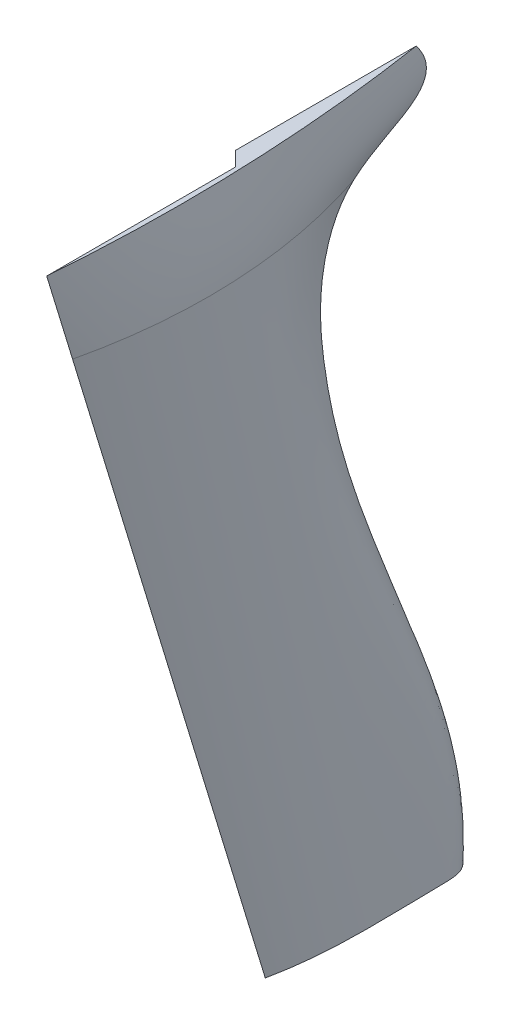
ISO-10303-21;
HEADER;
FILE_DESCRIPTION(('STEP AP214'),'2;1');
FILE_NAME('part.step','',(''),(''),'','','');
FILE_SCHEMA(('AUTOMOTIVE_DESIGN { 1 0 10303 214 1 1 1 1 }'));
ENDSEC;
DATA;
#1=APPLICATION_CONTEXT('core data for automotive mechanical design processes');
#2=APPLICATION_PROTOCOL_DEFINITION('international standard','automotive_design',2000,#1);
#3=PRODUCT_CONTEXT('',#1,'mechanical');
#4=PRODUCT('Part','Part','',(#3));
#5=PRODUCT_RELATED_PRODUCT_CATEGORY('part','',(#4));
#6=PRODUCT_DEFINITION_FORMATION('','',#4);
#7=PRODUCT_DEFINITION_CONTEXT('part definition',#1,'design');
#8=PRODUCT_DEFINITION('design','',#6,#7);
#9=PRODUCT_DEFINITION_SHAPE('','',#8);
#10=(LENGTH_UNIT() NAMED_UNIT(*) SI_UNIT(.MILLI.,.METRE.));
#11=(NAMED_UNIT(*) PLANE_ANGLE_UNIT() SI_UNIT($,.RADIAN.));
#12=(NAMED_UNIT(*) SI_UNIT($,.STERADIAN.) SOLID_ANGLE_UNIT());
#13=UNCERTAINTY_MEASURE_WITH_UNIT(LENGTH_MEASURE(1.E-05),#10,'distance_accuracy_value','');
#14=(GEOMETRIC_REPRESENTATION_CONTEXT(3) GLOBAL_UNCERTAINTY_ASSIGNED_CONTEXT((#13)) GLOBAL_UNIT_ASSIGNED_CONTEXT((#10,
#11,#12)) REPRESENTATION_CONTEXT('',''));
#15=CARTESIAN_POINT('',(0.,0.,0.));
#16=DIRECTION('',(0.,0.,1.));
#17=DIRECTION('',(1.,0.,0.));
#18=AXIS2_PLACEMENT_3D('',#15,#16,#17);
#19=CARTESIAN_POINT('',(1.17347259491747,0.,-15.0754418502589));
#20=DIRECTION('',(0.,-1.,0.));
#21=DIRECTION('',(1.,0.,0.));
#22=AXIS2_PLACEMENT_3D('',#19,#20,#21);
#23=PLANE('',#22);
#24=DIRECTION('',(0.,0.,1.));
#25=VECTOR('',#24,1.);
#26=CARTESIAN_POINT('',(0.,0.,-26.5534962443813));
#27=LINE('',#26,#25);
#28=CARTESIAN_POINT('',(0.,0.,-26.5534962443813));
#29=VERTEX_POINT('',#28);
#30=CARTESIAN_POINT('',(0.,0.,0.));
#31=VERTEX_POINT('',#30);
#32=EDGE_CURVE('E376',#29,#31,#27,.T.);
#33=ORIENTED_EDGE('',*,*,#32,.F.);
#34=DIRECTION('',(0.707106781186548,0.,0.707106781186547));
#35=VECTOR('',#34,1.);
#36=CARTESIAN_POINT('',(-2.032,0.,-28.5854962443813));
#37=LINE('',#36,#35);
#38=CARTESIAN_POINT('',(-2.032,0.,-28.5854962443813));
#39=VERTEX_POINT('',#38);
#40=EDGE_CURVE('E13',#39,#29,#37,.T.);
#41=ORIENTED_EDGE('',*,*,#40,.F.);
#42=CARTESIAN_POINT('',(0.,0.,0.));
#43=CARTESIAN_POINT('',(0.868955437855163,0.,-4.15213360251585));
#44=CARTESIAN_POINT('',(1.28304064187775,0.,-10.4499327545263));
#45=CARTESIAN_POINT('',(1.11302386498906,0.,-18.5577165385589));
#46=CARTESIAN_POINT('',(1.07985622164203,0.,-23.3867610957331));
#47=CARTESIAN_POINT('',(0.927305881123967,0.,-27.3895650347186));
#48=CARTESIAN_POINT('',(-1.06664213218579,0.,-28.7222309558563));
#49=CARTESIAN_POINT('',(-2.032,0.,-28.5854962443813));
#50=B_SPLINE_CURVE_WITH_KNOTS('',3,(#42,#43,#44,#45,#46,#47,#48,#49),.UNSPECIFIED.,.F.,.F.,(4,1,
1,1,1,4),(0.,0.41768328443092,0.626781802257852,0.798428839966411,0.906706218110106,1.),.UNSPECIFIED.);
#51=EDGE_CURVE('E201',#31,#39,#50,.T.);
#52=ORIENTED_EDGE('',*,*,#51,.F.);
#53=EDGE_LOOP('',(#33,#41,#52));
#54=FACE_BOUND('',#53,.T.);
#55=ADVANCED_FACE('F191',(#54),#23,.T.);
#56=CARTESIAN_POINT('',(-2.032,88.9,-1.49084743129355));
#57=DIRECTION('',(-1.,0.,0.));
#58=DIRECTION('',(0.,0.,-1.));
#59=AXIS2_PLACEMENT_3D('',#56,#57,#58);
#60=PLANE('',#59);
#61=DIRECTION('',(0.,0.956559534241169,0.291537060169574));
#62=VECTOR('',#61,1.);
#63=CARTESIAN_POINT('',(-2.032,44.45,-15.0381718378374));
#64=LINE('',#63,#62);
#65=CARTESIAN_POINT('',(-2.032,100.838,2.14757683789251));
#66=VERTEX_POINT('',#65);
#67=EDGE_CURVE('E331',#39,#66,#64,.T.);
#68=ORIENTED_EDGE('',*,*,#67,.T.);
#69=DIRECTION('',(0.,0.,-1.));
#70=VECTOR('',#69,1.);
#71=CARTESIAN_POINT('',(-2.032,100.838,2.14757683789251));
#72=LINE('',#71,#70);
#73=CARTESIAN_POINT('',(-2.03199999999998,100.838,-23.2524231621075));
#74=VERTEX_POINT('',#73);
#75=EDGE_CURVE('E258',#66,#74,#72,.T.);
#76=ORIENTED_EDGE('',*,*,#75,.T.);
#77=CARTESIAN_POINT('',(-2.03199999999999,88.9,-14.4490304308033));
#78=CARTESIAN_POINT('',(-2.032,90.1594035536287,-15.8258956353721));
#79=CARTESIAN_POINT('',(-2.032,92.9684732394471,-20.8132117463626));
#80=CARTESIAN_POINT('',(-2.032,96.0838747700888,-26.8664565291203));
#81=CARTESIAN_POINT('',(-2.03199999999998,100.838,-23.2524231621075));
#82=B_SPLINE_CURVE_WITH_KNOTS('',3,(#77,#78,#79,#80,#81),.UNSPECIFIED.,.F.,.F.,(4,1,4),(0.,
0.339308522008112,1.),.UNSPECIFIED.);
#83=CARTESIAN_POINT('',(-2.032,88.9,-14.4490304308033));
#84=VERTEX_POINT('',#83);
#85=EDGE_CURVE('E246',#84,#74,#82,.T.);
#86=ORIENTED_EDGE('',*,*,#85,.F.);
#87=CARTESIAN_POINT('',(-2.032,88.9,-14.4490304308033));
#88=CARTESIAN_POINT('',(-2.032,88.6360872823388,-14.1605031855499));
#89=CARTESIAN_POINT('',(-2.032,86.4749006328394,-12.0202240949158));
#90=CARTESIAN_POINT('',(-2.032,79.0529493440888,-9.22853105217397));
#91=CARTESIAN_POINT('',(-2.032,69.603367670543,-9.99601596826649));
#92=CARTESIAN_POINT('',(-2.032,52.7250369566644,-13.230740713342));
#93=CARTESIAN_POINT('',(-2.032,31.1220140510674,-22.6642550417858));
#94=CARTESIAN_POINT('',(-2.032,10.7417806882659,-29.6939795521676));
#95=CARTESIAN_POINT('',(-2.032,0.,-28.5854962443813));
#96=B_SPLINE_CURVE_WITH_KNOTS('',3,(#87,#88,#89,#90,#91,#92,#93,#94,#95),.UNSPECIFIED.,.F.,.F.,
(4,1,1,1,1,1,4),(0.,0.0130534385610087,0.101711711688787,0.238248525325182,0.317694364182804,
0.656493029064736,1.),.UNSPECIFIED.);
#97=EDGE_CURVE('E412',#84,#39,#96,.T.);
#98=ORIENTED_EDGE('',*,*,#97,.T.);
#99=EDGE_LOOP('',(#68,#76,#86,#98));
#100=FACE_BOUND('',#99,.T.);
#101=ADVANCED_FACE('F290',(#100),#60,.T.);
#102=CARTESIAN_POINT('',(-2.03199999999999,88.9,-14.4490304308033));
#103=CARTESIAN_POINT('',(-2.032,88.6360872823388,-14.1605031855499));
#104=CARTESIAN_POINT('',(-2.032,86.4749006328394,-12.0202240949158));
#105=CARTESIAN_POINT('',(-2.032,79.0529493440888,-9.22853105217397));
#106=CARTESIAN_POINT('',(-2.032,69.603367670543,-9.99601596826649));
#107=CARTESIAN_POINT('',(-2.032,52.7250369566644,-13.230740713342));
#108=CARTESIAN_POINT('',(-2.032,31.1220140510674,-22.6642550417858));
#109=CARTESIAN_POINT('',(-2.032,10.7417806882659,-29.6939795521676));
#110=CARTESIAN_POINT('',(-2.032,0.,-28.5854962443813));
#111=CARTESIAN_POINT('',(-1.9559496224145,88.9,-14.2235522282885));
#112=CARTESIAN_POINT('',(-1.95554155001475,88.6360872823388,-13.9361107416901));
#113=CARTESIAN_POINT('',(-1.95236187118313,86.4749006328394,-11.8042918258034));
#114=CARTESIAN_POINT('',(-1.94491382237869,79.0529493440888,-9.03241581419893));
#115=CARTESIAN_POINT('',(-1.93539023570062,69.603367670543,-9.82524014719032));
#116=CARTESIAN_POINT('',(-1.9180468405129,52.7250369566644,-13.1061104817331));
#117=CARTESIAN_POINT('',(-1.89423321080635,31.1220140510674,-22.6029857593033));
#118=CARTESIAN_POINT('',(-1.87290319137319,10.7417806882659,-29.6894630743949));
#119=CARTESIAN_POINT('',(-1.86216458688153,0.,-28.6095519826575));
#120=CARTESIAN_POINT('',(-1.80713196031202,88.9,-13.7755496574275));
#121=CARTESIAN_POINT('',(-1.80585583058491,88.6358472351154,-13.4907536622877));
#122=CARTESIAN_POINT('',(-1.79591259664375,86.4729948231026,-11.3793374867938));
#123=CARTESIAN_POINT('',(-1.77262376084683,79.0517502791207,-8.6509132552977));
#124=CARTESIAN_POINT('',(-1.74284934680535,69.602992932875,-9.49082670371665));
#125=CARTESIAN_POINT('',(-1.68863957857439,52.7255182951859,-12.8538621893159));
#126=CARTESIAN_POINT('',(-1.61423208278575,31.1206004433767,-22.4538046640227));
#127=CARTESIAN_POINT('',(-1.54761047706621,10.7406820083514,-29.6353732710566));
#128=CARTESIAN_POINT('',(-1.51407897800083,0.,-28.612413633352));
#129=CARTESIAN_POINT('',(-1.52203464518594,88.9,-12.8903344935873));
#130=CARTESIAN_POINT('',(-1.51902470577521,88.6344669635811,-12.61255084737));
#131=CARTESIAN_POINT('',(-1.49557341752237,86.462036417116,-10.5545624843619));
#132=CARTESIAN_POINT('',(-1.44065525221865,79.0448556555546,-7.92633551108036));
#133=CARTESIAN_POINT('',(-1.37046154066225,69.6008381912841,-8.84565803929346));
#134=CARTESIAN_POINT('',(-1.24271392280234,52.728285991684,-12.332669856822));
#135=CARTESIAN_POINT('',(-1.06748092983496,31.1124721991552,-22.0467719426185));
#136=CARTESIAN_POINT('',(-0.910693628926494,10.7343645988431,-29.3465407881865));
#137=CARTESIAN_POINT('',(-0.831819752824955,0.,-28.4352859121491));
#138=CARTESIAN_POINT('',(-1.18805733731017,88.9,-11.802124199579));
#139=CARTESIAN_POINT('',(-1.18319502238179,88.6311663142598,-11.536325825999));
#140=CARTESIAN_POINT('',(-1.14531408797997,86.435831533235,-9.56882772451127));
#141=CARTESIAN_POINT('',(-1.05662360631168,79.0283685122443,-7.09289761881771));
#142=CARTESIAN_POINT('',(-0.943302607426443,69.5956855483493,-8.09047702220413));
#143=CARTESIAN_POINT('',(-0.737178551375169,52.7349043963534,-11.6706569280489));
#144=CARTESIAN_POINT('',(-0.454672143473132,31.0930350934082,-21.3786093856023));
#145=CARTESIAN_POINT('',(-0.202136164140801,10.7192577500189,-28.7110034886836));
#146=CARTESIAN_POINT('',(-0.075177914403229,0.,-27.9409921624878));
#147=CARTESIAN_POINT('',(-0.819549326338881,88.9,-10.5194135512791));
#148=CARTESIAN_POINT('',(-0.813379296914512,88.625045110064,-10.2727894943692));
#149=CARTESIAN_POINT('',(-0.765315746988696,86.3872333849466,-8.44932156383716));
#150=CARTESIAN_POINT('',(-0.652822402458278,78.9977923555598,-6.20011203913702));
#151=CARTESIAN_POINT('',(-0.509165187588784,69.5861297378158,-7.27157420638974));
#152=CARTESIAN_POINT('',(-0.248083956450739,52.7471785286495,-10.8947894529509));
#153=CARTESIAN_POINT('',(0.109275358536762,31.0569880972954,-20.4131840583148));
#154=CARTESIAN_POINT('',(0.428260943571023,10.6912414121995,-27.646510289185));
#155=CARTESIAN_POINT('',(0.588460117036684,0.,-27.0581041196332));
#156=CARTESIAN_POINT('',(-0.479739894675935,88.9,-9.25369245473262));
#157=CARTESIAN_POINT('',(-0.473581179561342,88.6171235516929,-9.03047786958289));
#158=CARTESIAN_POINT('',(-0.425614404559167,86.3243416636322,-7.38245935052497));
#159=CARTESIAN_POINT('',(-0.313407560122343,78.958223211615,-5.40102145230849));
#160=CARTESIAN_POINT('',(-0.170238969265299,69.5737633947723,-6.5353229909613));
#161=CARTESIAN_POINT('',(0.0895992979041165,52.7630626998561,-10.154548280888));
#162=CARTESIAN_POINT('',(0.444507959411454,31.0103390435025,-19.3456858650201));
#163=CARTESIAN_POINT('',(0.760567139417229,10.6549849750214,-26.377406228522));
#164=CARTESIAN_POINT('',(0.919031733249027,0.,-25.9870644601396));
#165=CARTESIAN_POINT('',(-0.165062863150032,88.9,-7.99880875718269));
#166=CARTESIAN_POINT('',(-0.159782824326302,88.6077617099816,-7.80284619550879));
#167=CARTESIAN_POINT('',(-0.118672170295813,86.250015083897,-6.3589533915263));
#168=CARTESIAN_POINT('',(-0.0225911488315554,78.9114596778622,-4.68642238017228));
#169=CARTESIAN_POINT('',(0.0998226999140654,69.559148625721,-5.88533481285454));
#170=CARTESIAN_POINT('',(0.321474221850749,52.7818349021913,-9.48226586400675));
#171=CARTESIAN_POINT('',(0.623127658704488,30.9552083435653,-18.2625103168255));
#172=CARTESIAN_POINT('',(0.890677473417118,10.6121364583564,-25.0343513906021));
#173=CARTESIAN_POINT('',(1.02443122980886,0.,-24.867201427604));
#174=CARTESIAN_POINT('',(0.125620521389397,88.8999999999999,-6.75107978978765));
#175=CARTESIAN_POINT('',(0.129774859192403,88.5973196557652,-6.58533613357386));
#176=CARTESIAN_POINT('',(0.16210436175935,86.1671123603461,-5.36773838352001));
#177=CARTESIAN_POINT('',(0.237548813437833,78.8593003517532,-4.03651691207258));
#178=CARTESIAN_POINT('',(0.333436951397353,69.5428475371637,-5.30335288214067));
#179=CARTESIAN_POINT('',(0.506382929278929,52.8027731278727,-8.86787573074052));
#180=CARTESIAN_POINT('',(0.740318555897991,30.8937164090201,-17.1794639952424));
#181=CARTESIAN_POINT('',(0.946385529754647,10.5643438820762,-23.6521669623565));
#182=CARTESIAN_POINT('',(1.04889007283805,0.,-23.7292922652205));
#183=CARTESIAN_POINT('',(0.393449012092918,88.8999999999999,-5.50682288370583));
#184=CARTESIAN_POINT('',(0.396581313555321,88.5861574598786,-5.37330062284197));
#185=CARTESIAN_POINT('',(0.420937867823591,86.0784922075849,-4.39696898080149));
#186=CARTESIAN_POINT('',(0.477642025139658,78.8035438307402,-3.42910775367047));
#187=CARTESIAN_POINT('',(0.549435596360883,69.5254222356024,-4.7666504242177));
#188=CARTESIAN_POINT('',(0.678121970293454,52.8251553691185,-8.29307065523705));
#189=CARTESIAN_POINT('',(0.850483513689812,30.8279836514027,-16.0989352111977));
#190=CARTESIAN_POINT('',(1.00060911354405,10.5132552660525,-22.2476183258871));
#191=CARTESIAN_POINT('',(1.07466804797296,0.,-22.5837236433882));
#192=CARTESIAN_POINT('',(0.6395613621111,88.9,-4.26235537009558));
#193=CARTESIAN_POINT('',(0.641720028789185,88.5746351931571,-4.16205705186043));
#194=CARTESIAN_POINT('',(0.658481910633463,85.9870133402186,-3.43448727938086));
#195=CARTESIAN_POINT('',(0.6973397137753,78.7459887122751,-2.84103619203551));
#196=CARTESIAN_POINT('',(0.746197861745455,69.5074348275393,-4.25070956854566));
#197=CARTESIAN_POINT('',(0.832782011531339,52.8482596181464,-7.73624139103194));
#198=CARTESIAN_POINT('',(0.946629589314553,30.7601304822493,-15.0179356554071));
#199=CARTESIAN_POINT('',(1.043651010786,10.4605186301571,-20.8302360110418));
#200=CARTESIAN_POINT('',(1.09072710244833,0.,-21.4327118527897));
#201=CARTESIAN_POINT('',(0.865096324594509,88.9,-3.01399458011524));
#202=CARTESIAN_POINT('',(0.866357730870507,88.5631129264355,-2.94693837316528));
#203=CARTESIAN_POINT('',(0.876121859049864,85.8955344728521,-2.46827221304441));
#204=CARTESIAN_POINT('',(0.898544117446494,78.6884335938101,-2.24956442255488));
#205=CARTESIAN_POINT('',(0.926296544262942,69.4894474194761,-3.73179658500437));
#206=CARTESIAN_POINT('',(0.974184882170294,52.8713638671742,-7.17722431373725));
#207=CARTESIAN_POINT('',(1.03435235160497,30.6922773130959,-13.9358308987668));
#208=CARTESIAN_POINT('',(1.08275327749228,10.4077819942617,-19.4127179604036));
#209=CARTESIAN_POINT('',(1.10515884409931,0.,-20.2820501700442));
#210=CARTESIAN_POINT('',(1.07033923086197,88.9,-1.75789637607556));
#211=CARTESIAN_POINT('',(1.0707767666052,88.551950730549,-1.7231090304763));
#212=CARTESIAN_POINT('',(1.07411748479512,85.806914320091,-1.48607935169366));
#213=CARTESIAN_POINT('',(1.08146685049167,78.6326770727971,-1.63160278475155));
#214=CARTESIAN_POINT('',(1.0898913350177,69.4720221179149,-3.18566158894061));
#215=CARTESIAN_POINT('',(1.10242359473972,52.89374610842,-6.59504044027302));
#216=CARTESIAN_POINT('',(1.11371199438789,30.6265445554786,-12.8507603263635));
#217=CARTESIAN_POINT('',(1.11800444886947,10.356693378238,-18.006167950287));
#218=CARTESIAN_POINT('',(1.11808670398226,0.,-19.135752445633));
#219=CARTESIAN_POINT('',(1.25557541223233,88.9,-0.490216620287321));
#220=CARTESIAN_POINT('',(1.25528037985,88.5415086763326,-0.485736737351581));
#221=CARTESIAN_POINT('',(1.25291228537125,85.7240115965402,-0.475693013477959));
#222=CARTESIAN_POINT('',(1.24688466146152,78.5805177466881,-0.964150046775172));
#223=CARTESIAN_POINT('',(1.23819475434052,69.4557210293576,-2.58821943575869));
#224=CARTESIAN_POINT('',(1.21953213194995,52.9146843341015,-5.96901449829529));
#225=CARTESIAN_POINT('',(1.18792915799551,30.5650526209333,-11.7613578499615));
#226=CARTESIAN_POINT('',(1.15374579932155,10.3089008019578,-16.6223551987347));
#227=CARTESIAN_POINT('',(1.13443676742458,0.,-17.9985840189977));
#228=CARTESIAN_POINT('',(1.42109020002439,88.9,0.792888824938712));
#229=CARTESIAN_POINT('',(1.42013869091827,88.5321468346214,0.770014700883094));
#230=CARTESIAN_POINT('',(1.41265853781645,85.649685016805,0.575136844427835));
#231=CARTESIAN_POINT('',(1.394678514724,78.5337542129353,-0.224099283593483));
#232=CARTESIAN_POINT('',(1.37075050169147,69.4411062603063,-1.91518807742199));
#233=CARTESIAN_POINT('',(1.32446787921896,52.9334565364366,-5.27810820909811));
#234=CARTESIAN_POINT('',(1.25521491524757,30.5099219209962,-10.6656663046562));
#235=CARTESIAN_POINT('',(1.18757766203229,10.2660522852928,-15.2722535630983));
#236=CARTESIAN_POINT('',(1.15152251793649,0.,-16.8744120220383));
#237=CARTESIAN_POINT('',(1.56716892555701,88.9,2.09526409729177));
#238=CARTESIAN_POINT('',(1.56562231399791,88.5242252762503,2.04898248134313));
#239=CARTESIAN_POINT('',(1.55351286128818,85.5867932954906,1.67866907825939));
#240=CARTESIAN_POINT('',(1.52474273085724,78.4941850689905,0.611683539574993));
#241=CARTESIAN_POINT('',(1.48712715877653,69.4287399172628,-1.1422349611896));
#242=CARTESIAN_POINT('',(1.41623409426398,52.9493407076433,-4.50119018473934));
#243=CARTESIAN_POINT('',(1.31385503199575,30.4632728672032,-9.56157691746445));
#244=CARTESIAN_POINT('',(1.2172008781309,10.2297958481147,-13.9666328948655));
#245=CARTESIAN_POINT('',(1.16677094349928,0.,-15.7668732011107));
#246=CARTESIAN_POINT('',(1.69273944433795,88.9,3.42393892817588));
#247=CARTESIAN_POINT('',(1.69065101598806,88.5181040720544,3.35917840166342));
#248=CARTESIAN_POINT('',(1.67433267675439,85.5381951472021,2.85025148636798));
#249=CARTESIAN_POINT('',(1.63579341459826,78.463608912306,1.5692207542143));
#250=CARTESIAN_POINT('',(1.58586978779936,69.4191841067293,-0.242395796621982));
#251=CARTESIAN_POINT('',(1.49309223266428,52.9616148399393,-3.61496451895105));
#252=CARTESIAN_POINT('',(1.3617802885445,30.4272258710905,-8.4454579202056));
#253=CARTESIAN_POINT('',(1.24030777727729,10.2017795102953,-12.7153146666687));
#254=CARTESIAN_POINT('',(1.17777495310032,0.,-14.6789452144802));
#255=CARTESIAN_POINT('',(1.79672961187503,88.9,4.78594304899508));
#256=CARTESIAN_POINT('',(1.79414628262001,88.5141432928689,4.70861644882846));
#257=CARTESIAN_POINT('',(1.77399051706578,85.5067492865449,4.10525111575255));
#258=CARTESIAN_POINT('',(1.72659315431846,78.4438243403336,2.67459389999009));
#259=CARTESIAN_POINT('',(1.665610048674,69.4130009352075,0.811404009906235));
#260=CARTESIAN_POINT('',(1.55346339941746,52.9695569255426,-2.59593195321295));
#261=CARTESIAN_POINT('',(1.39718141944748,30.403901344194,-7.31334642991845));
#262=CARTESIAN_POINT('',(1.25494048705496,10.1836512917063,-11.5276747986516));
#263=CARTESIAN_POINT('',(1.18252248547463,0.,-13.6131025542258));
#264=CARTESIAN_POINT('',(1.85095472640902,88.9,5.72085181043394));
#265=CARTESIAN_POINT('',(1.8480530282904,88.5131831039754,5.63974827473003));
#266=CARTESIAN_POINT('',(1.8255760269758,85.4991260475977,5.00778777283717));
#267=CARTESIAN_POINT('',(1.77282097711013,78.4390280804615,3.52749755495299));
#268=CARTESIAN_POINT('',(1.7052274447132,69.4115019845356,1.63470793351194));
#269=CARTESIAN_POINT('',(1.58173642506937,52.9714822796283,-1.81222428124855));
#270=CARTESIAN_POINT('',(1.41133973228952,30.3982469134312,-6.54506001592314));
#271=CARTESIAN_POINT('',(1.25789317920115,10.1792565720483,-10.7842923217821));
#272=CARTESIAN_POINT('',(1.18034709673696,0.,-12.9185464952724));
#273=CARTESIAN_POINT('',(1.95231035963934,88.9,7.80128694755959));
#274=CARTESIAN_POINT('',(1.94884600938741,88.5131831039754,7.71766740754166));
#275=CARTESIAN_POINT('',(1.92140329573086,85.4991260475977,7.06612851355741));
#276=CARTESIAN_POINT('',(1.85747676744645,78.4390280804615,5.53994339266732));
#277=CARTESIAN_POINT('',(1.77619953718715,69.4115019845356,3.58842078766484));
#278=CARTESIAN_POINT('',(1.6295244677899,52.9714822796283,0.0344193781371283));
#279=CARTESIAN_POINT('',(1.43095053621974,30.3982469134312,-4.84556240751378));
#280=CARTESIAN_POINT('',(1.25585932099478,10.1792565720483,-9.21658881999284));
#281=CARTESIAN_POINT('',(1.16870018137132,0.,-11.4171426331261));
#282=CARTESIAN_POINT('',(2.01608721249375,88.8999999999999,11.2072136835474));
#283=CARTESIAN_POINT('',(2.01217125506739,88.5131831039753,11.1180815522521));
#284=CARTESIAN_POINT('',(1.97979828452529,85.4991260475976,10.4236557640415));
#285=CARTESIAN_POINT('',(1.90493466951798,78.4390280804614,8.79697360244846));
#286=CARTESIAN_POINT('',(1.81013614790161,69.4115019845355,6.71691107745006));
#287=CARTESIAN_POINT('',(1.64017628888484,52.9714822796283,2.92874039676285));
#288=CARTESIAN_POINT('',(1.4124514481812,30.3982469134312,-2.27287387929559));
#289=CARTESIAN_POINT('',(1.21402229539322,10.1792565720483,-6.93198427805679));
#290=CARTESIAN_POINT('',(1.11610425212768,0.,-9.27753388974019));
#291=CARTESIAN_POINT('',(1.72827279068644,88.9000000000001,16.716380587797));
#292=CARTESIAN_POINT('',(1.72478241494578,88.5131831039755,16.6164276134621));
#293=CARTESIAN_POINT('',(1.69607431116208,85.4991260475978,15.8376700492429));
#294=CARTESIAN_POINT('',(1.62961402257457,78.4390280804616,14.0134623178466));
#295=CARTESIAN_POINT('',(1.54538671414488,69.4115019845357,11.6808440980931));
#296=CARTESIAN_POINT('',(1.39417602376949,52.9714822796284,7.43277646906147));
#297=CARTESIAN_POINT('',(1.19113728961932,30.3982469134313,1.59973170550849));
#298=CARTESIAN_POINT('',(1.0137798704581,10.1792565720483,-3.62495659743153));
#299=CARTESIAN_POINT('',(0.926098928754307,0.,-6.25526183448512));
#300=CARTESIAN_POINT('',(1.0312848852431,88.8999999999999,22.1888539755757));
#301=CARTESIAN_POINT('',(1.02937742539862,88.5131831039754,22.0781862932825));
#302=CARTESIAN_POINT('',(1.01404958918777,85.4991260475977,21.2158912742396));
#303=CARTESIAN_POINT('',(0.978387443733022,78.4390280804615,19.1960433129988));
#304=CARTESIAN_POINT('',(0.933019184945428,69.4115019845356,16.6133082504037));
#305=CARTESIAN_POINT('',(0.851068500408449,52.9714822796283,11.9098490673714));
#306=CARTESIAN_POINT('',(0.739955109714199,30.3982469134312,5.45163695552648));
#307=CARTESIAN_POINT('',(0.641816498168853,10.1792565720483,-0.333022527216954));
#308=CARTESIAN_POINT('',(0.592903878835764,0.,-3.24529085361548));
#309=CARTESIAN_POINT('',(0.362531354574868,88.9,25.5290894662403));
#310=CARTESIAN_POINT('',(0.361986393419719,88.5131831039754,25.4130752302268));
#311=CARTESIAN_POINT('',(0.357740084553683,85.4991260475977,24.5090983608335));
#312=CARTESIAN_POINT('',(0.347793571918959,78.4390280804615,22.3916317241496));
#313=CARTESIAN_POINT('',(0.335075277811513,69.4115019845356,19.6840934705876));
#314=CARTESIAN_POINT('',(0.311914003779464,52.9714822796283,14.7533979768977));
#315=CARTESIAN_POINT('',(0.280112041282401,30.3982469134312,7.98322665740194));
#316=CARTESIAN_POINT('',(0.251626821413209,10.1792565720484,1.9191411907977));
#317=CARTESIAN_POINT('',(0.237285929179523,0.,-1.13382440229888));
#318=CARTESIAN_POINT('',(0.,88.9,27.0946488130878));
#319=CARTESIAN_POINT('',(0.,88.5131831039754,26.9767560352165));
#320=CARTESIAN_POINT('',(0.,85.4991260475977,26.0581416657546));
#321=CARTESIAN_POINT('',(0.,78.4390280804615,23.906388291114));
#322=CARTESIAN_POINT('',(0.,69.4115019845356,21.1550086598418));
#323=CARTESIAN_POINT('',(0.,52.9714822796283,16.1444736723873));
#324=CARTESIAN_POINT('',(0.,30.3982469134312,9.26467744266534));
#325=CARTESIAN_POINT('',(0.,10.1792565720484,3.10240024744618));
#326=CARTESIAN_POINT('',(0.,0.,0.));
#327=B_SPLINE_SURFACE_WITH_KNOTS('',3,3,((#102,#103,#104,#105,#106,#107,#108,#109,#110),(#111,
#112,#113,#114,#115,#116,#117,#118,#119),(#120,#121,#122,#123,#124,#125,#126,#127,#128),(#129,
#130,#131,#132,#133,#134,#135,#136,#137),(#138,#139,#140,#141,#142,#143,#144,#145,#146),(#147,
#148,#149,#150,#151,#152,#153,#154,#155),(#156,#157,#158,#159,#160,#161,#162,#163,#164),(#165,
#166,#167,#168,#169,#170,#171,#172,#173),(#174,#175,#176,#177,#178,#179,#180,#181,#182),(#183,
#184,#185,#186,#187,#188,#189,#190,#191),(#192,#193,#194,#195,#196,#197,#198,#199,#200),(#201,
#202,#203,#204,#205,#206,#207,#208,#209),(#210,#211,#212,#213,#214,#215,#216,#217,#218),(#219,
#220,#221,#222,#223,#224,#225,#226,#227),(#228,#229,#230,#231,#232,#233,#234,#235,#236),(#237,
#238,#239,#240,#241,#242,#243,#244,#245),(#246,#247,#248,#249,#250,#251,#252,#253,#254),(#255,
#256,#257,#258,#259,#260,#261,#262,#263),(#264,#265,#266,#267,#268,#269,#270,#271,#272),(#273,
#274,#275,#276,#277,#278,#279,#280,#281),(#282,#283,#284,#285,#286,#287,#288,#289,#290),(#291,
#292,#293,#294,#295,#296,#297,#298,#299),(#300,#301,#302,#303,#304,#305,#306,#307,#308),(#309,
#310,#311,#312,#313,#314,#315,#316,#317),(#318,#319,#320,#321,#322,#323,#324,#325,#326)),
.UNSPECIFIED.,.F.,.F.,.F.,(4,1,1,1,1,1,1,1,1,1,1,1,1,1,1,1,1,2,1,1,1,4),(4,1,1,1,1,1,4),(0.,
0.0169454406746567,0.0338908813493135,0.0677817626986269,0.10167264404794,0.135563525397254,
0.169454406746567,0.203345288095881,0.237236169445194,0.271127050794508,0.305017932143821,
0.338908813493135,0.372799694842448,0.406690576191762,0.440581457541075,0.474472338890388,
0.508363220239702,0.542254101589015,0.656690576191762,0.771127050794508,0.885563525397254,1.),
(0.,0.0130534385610087,0.101711711688787,0.238248525325182,0.317694364182804,0.656493029064736,
1.),.UNSPECIFIED.);
#328=CARTESIAN_POINT('',(-74.2356175089241,88.9,9.90415454827042));
#329=DIRECTION('',(0.,1.,0.));
#330=DIRECTION('',(-1.,0.,0.));
#331=AXIS2_PLACEMENT_3D('',#328,#329,#330);
#332=CIRCLE('',#331,76.2);
#333=CARTESIAN_POINT('',(0.,88.9,27.0946488130878));
#334=VERTEX_POINT('',#333);
#335=EDGE_CURVE('E257',#334,#84,#332,.T.);
#336=DIRECTION('',(0.,-0.956559534241167,-0.291537060169581));
#337=VECTOR('',#336,1.);
#338=CARTESIAN_POINT('',(0.,44.45,13.5473244065439));
#339=LINE('',#338,#337);
#340=EDGE_CURVE('E243',#334,#31,#339,.T.);
#341=ORIENTED_EDGE('',*,*,#335,.F.);
#342=ORIENTED_EDGE('',*,*,#340,.T.);
#343=ORIENTED_EDGE('',*,*,#51,.T.);
#344=ORIENTED_EDGE('',*,*,#97,.F.);
#345=EDGE_LOOP('',(#341,#342,#343,#344));
#346=FACE_BOUND('',#345,.T.);
#347=ADVANCED_FACE('F348',(#346),#327,.T.);
#348=CARTESIAN_POINT('',(0.,88.9,0.541152568706431));
#349=DIRECTION('',(-0.691236908369043,-0.21067290527451,0.691236908369051));
#350=DIRECTION('',(-0.707106781186553,0.,-0.707106781186542));
#351=AXIS2_PLACEMENT_3D('',#348,#349,#350);
#352=PLANE('',#351);
#353=DIRECTION('',(0.,-0.956559534241166,-0.291537060169583));
#354=VECTOR('',#353,1.);
#355=CARTESIAN_POINT('',(0.,44.45,-13.0061718378374));
#356=LINE('',#355,#354);
#357=CARTESIAN_POINT('',(0.,100.838,4.17957683789251));
#358=VERTEX_POINT('',#357);
#359=EDGE_CURVE('E209',#358,#29,#356,.T.);
#360=ORIENTED_EDGE('',*,*,#359,.F.);
#361=DIRECTION('',(-0.707106781186548,0.,-0.707106781186547));
#362=VECTOR('',#361,1.);
#363=CARTESIAN_POINT('',(0.,100.838,4.17957683789251));
#364=LINE('',#363,#362);
#365=EDGE_CURVE('E266',#358,#66,#364,.T.);
#366=ORIENTED_EDGE('',*,*,#365,.T.);
#367=ORIENTED_EDGE('',*,*,#67,.F.);
#368=ORIENTED_EDGE('',*,*,#40,.T.);
#369=EDGE_LOOP('',(#360,#366,#367,#368));
#370=FACE_BOUND('',#369,.T.);
#371=ADVANCED_FACE('F330',(#370),#352,.T.);
#372=CARTESIAN_POINT('',(0.,88.9,27.0946488130878));
#373=DIRECTION('',(-1.,0.,0.));
#374=DIRECTION('',(0.,0.,-1.));
#375=AXIS2_PLACEMENT_3D('',#372,#373,#374);
#376=PLANE('',#375);
#377=ORIENTED_EDGE('',*,*,#340,.F.);
#378=DIRECTION('',(0.,0.956559534241169,0.291537060169575));
#379=VECTOR('',#378,1.);
#380=CARTESIAN_POINT('',(0.,94.869,28.9138609476808));
#381=LINE('',#380,#379);
#382=CARTESIAN_POINT('',(0.,100.838,30.7330730822738));
#383=VERTEX_POINT('',#382);
#384=EDGE_CURVE('E237',#334,#383,#381,.T.);
#385=ORIENTED_EDGE('',*,*,#384,.T.);
#386=DIRECTION('',(0.,0.,-1.));
#387=VECTOR('',#386,1.);
#388=CARTESIAN_POINT('',(0.,100.838,30.7330730822738));
#389=LINE('',#388,#387);
#390=EDGE_CURVE('E241',#383,#358,#389,.T.);
#391=ORIENTED_EDGE('',*,*,#390,.T.);
#392=ORIENTED_EDGE('',*,*,#359,.T.);
#393=ORIENTED_EDGE('',*,*,#32,.T.);
#394=EDGE_LOOP('',(#377,#385,#391,#392,#393));
#395=FACE_BOUND('',#394,.T.);
#396=ADVANCED_FACE('F239',(#395),#376,.T.);
#397=CARTESIAN_POINT('',(-232.198687929261,100.838,12.4419810446311));
#398=DIRECTION('',(0.,1.,0.));
#399=DIRECTION('',(0.,0.,1.));
#400=AXIS2_PLACEMENT_3D('',#397,#398,#399);
#401=PLANE('',#400);
#402=ORIENTED_EDGE('',*,*,#390,.F.);
#403=CARTESIAN_POINT('',(-232.198687929261,100.838,12.4419810446311));
#404=DIRECTION('',(0.,1.,0.));
#405=DIRECTION('',(0.,0.,1.));
#406=AXIS2_PLACEMENT_3D('',#403,#404,#405);
#407=CIRCLE('',#406,232.918);
#408=EDGE_CURVE('E249',#383,#74,#407,.T.);
#409=ORIENTED_EDGE('',*,*,#408,.T.);
#410=ORIENTED_EDGE('',*,*,#75,.F.);
#411=ORIENTED_EDGE('',*,*,#365,.F.);
#412=EDGE_LOOP('',(#402,#409,#410,#411));
#413=FACE_BOUND('',#412,.T.);
#414=ADVANCED_FACE('F264',(#413),#401,.T.);
#415=CARTESIAN_POINT('',(0.,88.9,27.0946488130878));
#416=CARTESIAN_POINT('',(0.,90.2502217119109,27.5061649334931));
#417=CARTESIAN_POINT('',(0.,94.2295550452443,28.7189730232218));
#418=CARTESIAN_POINT('',(0.,98.2088883785776,29.9317811129504));
#419=CARTESIAN_POINT('',(0.,100.838,30.7330730822738));
#420=CARTESIAN_POINT('',(0.376983281171892,88.9,25.4666801091504));
#421=CARTESIAN_POINT('',(0.353421637227253,90.2502217119109,25.8201583121344));
#422=CARTESIAN_POINT('',(0.283981459877123,94.2295550452443,26.8619187751254));
#423=CARTESIAN_POINT('',(0.214541282526993,98.2088883785776,27.9036792381164));
#424=CARTESIAN_POINT('',(0.168662749121517,100.838,28.5919614981234));
#425=CARTESIAN_POINT('',(1.04922158996745,88.9,22.07314528032));
#426=CARTESIAN_POINT('',(0.997200250957333,90.2071722272174,22.3410459095941));
#427=CARTESIAN_POINT('',(0.826083768082575,94.1026808823475,23.1346120913854));
#428=CARTESIAN_POINT('',(0.603644925978718,98.1250637003743,23.9399292521854));
#429=CARTESIAN_POINT('',(0.434146800529715,100.838,24.4771181340342));
#430=CARTESIAN_POINT('',(1.72430209052684,88.9,16.7160245066786));
#431=CARTESIAN_POINT('',(1.6743497273113,90.0780237731369,16.9027327054764));
#432=CARTESIAN_POINT('',(1.456517034986,93.7220583936574,17.4690285552479));
#433=CARTESIAN_POINT('',(1.03427437374202,97.8735896657648,18.0822930326568));
#434=CARTESIAN_POINT('',(0.66564627485158,100.838,18.5079521001753));
#435=CARTESIAN_POINT('',(2.01315043327367,88.8999999999999,11.3242675295412));
#436=CARTESIAN_POINT('',(1.99097587506595,89.9488753190563,11.4332896158584));
#437=CARTESIAN_POINT('',(1.80337202853524,93.3414359049671,11.7825796094571));
#438=CARTESIAN_POINT('',(1.26002953939176,97.622115631155,12.2139853025281));
#439=CARTESIAN_POINT('',(0.745236006205444,100.838,12.5348289120058));
#440=CARTESIAN_POINT('',(1.95542760709877,88.9,7.86527185830431));
#441=CARTESIAN_POINT('',(1.94998369485788,89.9058258343629,7.89526091573998));
#442=CARTESIAN_POINT('',(1.79624068839431,93.2145617420705,8.01550603545767));
#443=CARTESIAN_POINT('',(1.2389545520798,97.5382909529518,8.22947668006864));
#444=CARTESIAN_POINT('',(0.694344857636755,100.838,8.41174417075456));
#445=CARTESIAN_POINT('',(1.78459662218156,88.9,4.35877920264773));
#446=CARTESIAN_POINT('',(1.78271629148402,89.9058258343629,4.27530936216545));
#447=CARTESIAN_POINT('',(1.64277205082041,93.2145617420705,4.06097783375665));
#448=CARTESIAN_POINT('',(1.10421173967353,97.5382909529518,3.9401741334209));
#449=CARTESIAN_POINT('',(0.574678509294239,100.838,3.90120117875965));
#450=CARTESIAN_POINT('',(1.48078272547264,88.9,0.823298161545762));
#451=CARTESIAN_POINT('',(1.47225814588259,89.9375230492711,0.544698352277591));
#452=CARTESIAN_POINT('',(1.33147567918394,93.1838006792426,-0.364969784322438));
#453=CARTESIAN_POINT('',(0.844808688607858,97.3564889300939,-1.32615869906142));
#454=CARTESIAN_POINT('',(0.372869116250255,100.838,-0.973836180294987));
#455=CARTESIAN_POINT('',(0.692716414193703,88.9,-4.2724123954529));
#456=CARTESIAN_POINT('',(0.659532546400238,90.0326146939958,-4.96148605025311));
#457=CARTESIAN_POINT('',(0.496475927488762,93.0915174907588,-7.44131358029481));
#458=CARTESIAN_POINT('',(0.13701581113107,96.8110828615203,-10.4074580759155));
#459=CARTESIAN_POINT('',(-0.185737630080989,100.838,-8.54009777749522));
#460=CARTESIAN_POINT('',(-0.435282643043368,88.9,-9.30380710453235));
#461=CARTESIAN_POINT('',(-0.481996341137883,90.1277063387205,-10.4081195035171));
#462=CARTESIAN_POINT('',(-0.635822160271613,92.999234302275,-14.4720731701555));
#463=CARTESIAN_POINT('',(-0.838506808950615,96.2656767929466,-19.4570622939917));
#464=CARTESIAN_POINT('',(-0.993601271670618,100.838,-16.0838178406279));
#465=CARTESIAN_POINT('',(-1.44407052919154,88.9,-12.7059058797865));
#466=CARTESIAN_POINT('',(-1.46958542091949,90.1594035536287,-14.0156635281837));
#467=CARTESIAN_POINT('',(-1.54478215213312,92.9684732394471,-18.805202242443));
#468=CARTESIAN_POINT('',(-1.61997888334676,96.0838747700888,-24.6606696284693));
#469=CARTESIAN_POINT('',(-1.66966072283244,100.838,-20.9159664208967));
#470=CARTESIAN_POINT('',(-2.03199999999999,88.9,-14.4490304308033));
#471=CARTESIAN_POINT('',(-2.032,90.1594035536287,-15.8258956353721));
#472=CARTESIAN_POINT('',(-2.032,92.9684732394471,-20.8132117463626));
#473=CARTESIAN_POINT('',(-2.032,96.0838747700888,-26.8664565291203));
#474=CARTESIAN_POINT('',(-2.03199999999998,100.838,-23.2524231621075));
#475=B_SPLINE_SURFACE_WITH_KNOTS('',3,3,((#415,#416,#417,#418,#419),(#420,#421,#422,#423,#424),
(#425,#426,#427,#428,#429),(#430,#431,#432,#433,#434),(#435,#436,#437,#438,#439),(#440,#441,
#442,#443,#444),(#445,#446,#447,#448,#449),(#450,#451,#452,#453,#454),(#455,#456,#457,#458,
#459),(#460,#461,#462,#463,#464),(#465,#466,#467,#468,#469),(#470,#471,#472,#473,#474)),
.UNSPECIFIED.,.F.,.F.,.F.,(4,1,1,1,2,1,1,1,4),(4,1,4),(0.,0.118998362864578,0.237996725729156,
0.356995088593734,0.475993451458312,0.606995088593734,0.737996725729156,0.868998362864578,1.),
(0.,0.339308522008112,1.),.UNSPECIFIED.);
#476=ORIENTED_EDGE('',*,*,#335,.T.);
#477=ORIENTED_EDGE('',*,*,#85,.T.);
#478=ORIENTED_EDGE('',*,*,#408,.F.);
#479=ORIENTED_EDGE('',*,*,#384,.F.);
#480=EDGE_LOOP('',(#476,#477,#478,#479));
#481=FACE_BOUND('',#480,.T.);
#482=ADVANCED_FACE('F251',(#481),#475,.T.);
#483=CLOSED_SHELL('',(#55,#101,#347,#371,#396,#414,#482));
#484=MANIFOLD_SOLID_BREP('B2',#483);
#485=ADVANCED_BREP_SHAPE_REPRESENTATION('',(#18,#484),#14);
#486=SHAPE_DEFINITION_REPRESENTATION(#9,#485);
ENDSEC;
END-ISO-10303-21;
